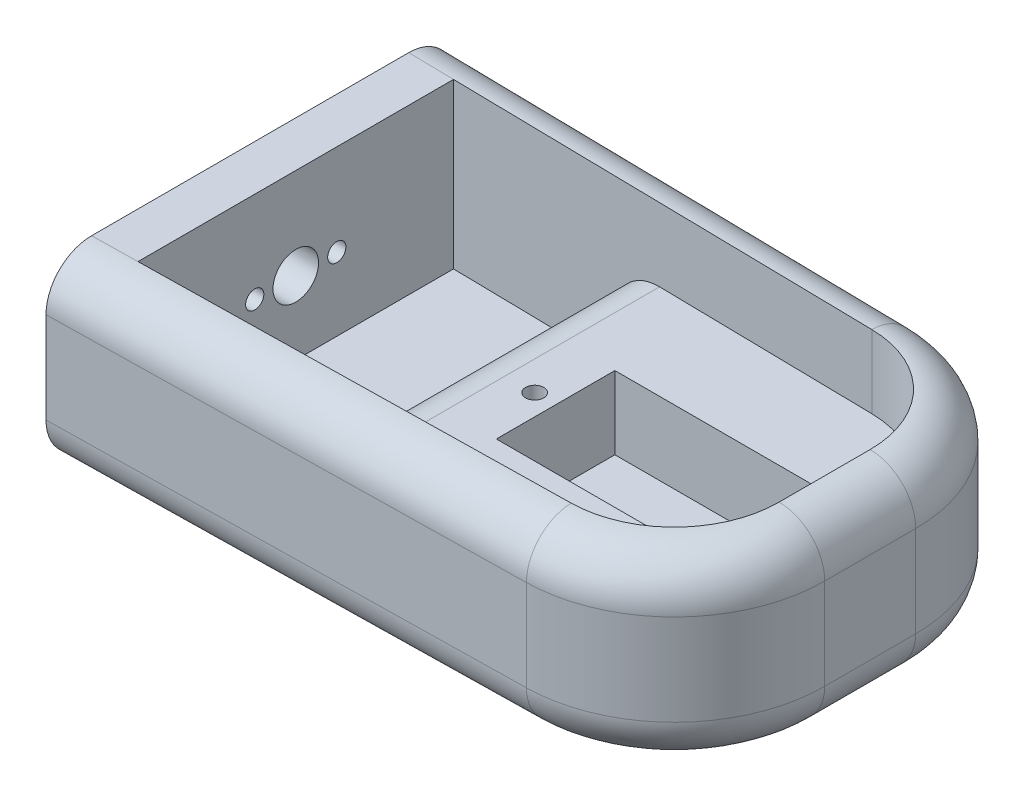
ISO-10303-21;
HEADER;
FILE_DESCRIPTION(('STEP AP214'),'2;1');
FILE_NAME('part.step','',(''),(''),'','','');
FILE_SCHEMA(('AUTOMOTIVE_DESIGN { 1 0 10303 214 1 1 1 1 }'));
ENDSEC;
DATA;
#1=APPLICATION_CONTEXT('core data for automotive mechanical design processes');
#2=APPLICATION_PROTOCOL_DEFINITION('international standard','automotive_design',2000,#1);
#3=PRODUCT_CONTEXT('',#1,'mechanical');
#4=PRODUCT('Part','Part','',(#3));
#5=PRODUCT_RELATED_PRODUCT_CATEGORY('part','',(#4));
#6=PRODUCT_DEFINITION_FORMATION('','',#4);
#7=PRODUCT_DEFINITION_CONTEXT('part definition',#1,'design');
#8=PRODUCT_DEFINITION('design','',#6,#7);
#9=PRODUCT_DEFINITION_SHAPE('','',#8);
#10=(LENGTH_UNIT() NAMED_UNIT(*) SI_UNIT(.MILLI.,.METRE.));
#11=(NAMED_UNIT(*) PLANE_ANGLE_UNIT() SI_UNIT($,.RADIAN.));
#12=(NAMED_UNIT(*) SI_UNIT($,.STERADIAN.) SOLID_ANGLE_UNIT());
#13=UNCERTAINTY_MEASURE_WITH_UNIT(LENGTH_MEASURE(1.E-05),#10,'distance_accuracy_value','');
#14=(GEOMETRIC_REPRESENTATION_CONTEXT(3) GLOBAL_UNCERTAINTY_ASSIGNED_CONTEXT((#13)) GLOBAL_UNIT_ASSIGNED_CONTEXT((#10,
#11,#12)) REPRESENTATION_CONTEXT('',''));
#15=CARTESIAN_POINT('',(0.,0.,0.));
#16=DIRECTION('',(0.,0.,1.));
#17=DIRECTION('',(1.,0.,0.));
#18=AXIS2_PLACEMENT_3D('',#15,#16,#17);
#19=CARTESIAN_POINT('',(0.,4.,0.));
#20=DIRECTION('',(0.,1.,0.));
#21=DIRECTION('',(0.,0.,1.));
#22=AXIS2_PLACEMENT_3D('',#19,#20,#21);
#23=PLANE('',#22);
#24=CARTESIAN_POINT('',(50.,4.,-22.39));
#25=DIRECTION('',(0.,1.,0.));
#26=DIRECTION('',(0.,0.,1.));
#27=AXIS2_PLACEMENT_3D('',#24,#25,#26);
#28=CIRCLE('',#27,6.5);
#29=CARTESIAN_POINT('',(50.,4.,-15.89));
#30=VERTEX_POINT('',#29);
#31=CARTESIAN_POINT('',(56.5,4.,-22.39));
#32=VERTEX_POINT('',#31);
#33=EDGE_CURVE('E218',#30,#32,#28,.T.);
#34=ORIENTED_EDGE('',*,*,#33,.F.);
#35=DIRECTION('',(1.,0.,0.));
#36=VECTOR('',#35,1.);
#37=CARTESIAN_POINT('',(56.5,4.,-15.89));
#38=LINE('',#37,#36);
#39=CARTESIAN_POINT('',(56.5,4.,-15.89));
#40=VERTEX_POINT('',#39);
#41=EDGE_CURVE('E229',#30,#40,#38,.T.);
#42=ORIENTED_EDGE('',*,*,#41,.T.);
#43=DIRECTION('',(0.,0.,-1.));
#44=VECTOR('',#43,1.);
#45=CARTESIAN_POINT('',(56.5,4.,-15.89));
#46=LINE('',#45,#44);
#47=EDGE_CURVE('E232',#40,#32,#46,.T.);
#48=ORIENTED_EDGE('',*,*,#47,.T.);
#49=EDGE_LOOP('',(#34,#42,#48));
#50=FACE_BOUND('',#49,.T.);
#51=ADVANCED_FACE('F52',(#50),#23,.T.);
#52=CARTESIAN_POINT('',(50.,4.,-28.89));
#53=VERTEX_POINT('',#52);
#54=EDGE_CURVE('E220',#32,#53,#28,.T.);
#55=ORIENTED_EDGE('',*,*,#54,.F.);
#56=CARTESIAN_POINT('',(56.5,4.,-28.89));
#57=VERTEX_POINT('',#56);
#58=EDGE_CURVE('E262',#32,#57,#46,.T.);
#59=ORIENTED_EDGE('',*,*,#58,.T.);
#60=DIRECTION('',(-1.,0.,0.));
#61=VECTOR('',#60,1.);
#62=CARTESIAN_POINT('',(56.5,4.,-28.89));
#63=LINE('',#62,#61);
#64=EDGE_CURVE('E907',#57,#53,#63,.T.);
#65=ORIENTED_EDGE('',*,*,#64,.T.);
#66=EDGE_LOOP('',(#55,#59,#65));
#67=FACE_BOUND('',#66,.T.);
#68=ADVANCED_FACE('F510',(#67),#23,.T.);
#69=CARTESIAN_POINT('',(51.7007026740287,20.,-5.90320076222937));
#70=DIRECTION('',(-0.0174524064372871,0.,-0.999847695156391));
#71=DIRECTION('',(-0.999847695156391,0.,0.0174524064372871));
#72=AXIS2_PLACEMENT_3D('',#69,#70,#71);
#73=PLANE('',#72);
#74=DIRECTION('',(0.999847695156391,0.,-0.0174524064372872));
#75=VECTOR('',#74,1.);
#76=CARTESIAN_POINT('',(51.7007026740287,12.,-5.90320076222937));
#77=LINE('',#76,#75);
#78=CARTESIAN_POINT('',(28.,12.,-5.48950345820973));
#79=VERTEX_POINT('',#78);
#80=CARTESIAN_POINT('',(51.7007026740287,12.,-5.90320076222937));
#81=VERTEX_POINT('',#80);
#82=EDGE_CURVE('E271',#79,#81,#77,.T.);
#83=ORIENTED_EDGE('',*,*,#82,.F.);
#84=CARTESIAN_POINT('',(28.,7.,-5.48950345820973));
#85=DIRECTION('',(-0.0174524064372871,0.,-0.999847695156391));
#86=DIRECTION('',(-0.999847695156391,0.,0.0174524064372871));
#87=AXIS2_PLACEMENT_3D('',#84,#85,#86);
#88=ELLIPSE('',#87,5.00076164021954,5.);
#89=CARTESIAN_POINT('',(23.,7.,-5.40222813356863));
#90=VERTEX_POINT('',#89);
#91=EDGE_CURVE('E61',#79,#90,#88,.F.);
#92=ORIENTED_EDGE('',*,*,#91,.T.);
#93=DIRECTION('',(0.,-1.,0.));
#94=VECTOR('',#93,1.);
#95=CARTESIAN_POINT('',(23.,12.,-5.40222813356863));
#96=LINE('',#95,#94);
#97=CARTESIAN_POINT('',(23.,2.,-5.40222813356863));
#98=VERTEX_POINT('',#97);
#99=EDGE_CURVE('E282',#90,#98,#96,.T.);
#100=ORIENTED_EDGE('',*,*,#99,.T.);
#101=DIRECTION('',(0.999847695156391,0.,-0.0174524064372871));
#102=VECTOR('',#101,1.);
#103=CARTESIAN_POINT('',(51.8748005842509,2.,-5.90623965255616));
#104=LINE('',#103,#102);
#105=CARTESIAN_POINT('',(5.,2.,-5.08803696486064));
#106=VERTEX_POINT('',#105);
#107=EDGE_CURVE('E288',#106,#98,#104,.T.);
#108=ORIENTED_EDGE('',*,*,#107,.F.);
#109=DIRECTION('',(0.,-1.,0.));
#110=VECTOR('',#109,1.);
#111=CARTESIAN_POINT('',(5.,20.,-5.08803696486064));
#112=LINE('',#111,#110);
#113=CARTESIAN_POINT('',(5.,20.,-5.08803696486064));
#114=VERTEX_POINT('',#113);
#115=EDGE_CURVE('E297',#114,#106,#112,.T.);
#116=ORIENTED_EDGE('',*,*,#115,.F.);
#117=DIRECTION('',(0.999847695156391,0.,-0.0174524064372871));
#118=VECTOR('',#117,1.);
#119=CARTESIAN_POINT('',(51.8748005842509,20.,-5.90623965255616));
#120=LINE('',#119,#118);
#121=CARTESIAN_POINT('',(51.7007026740287,20.,-5.90320076222937));
#122=VERTEX_POINT('',#121);
#123=EDGE_CURVE('E315',#114,#122,#120,.T.);
#124=ORIENTED_EDGE('',*,*,#123,.T.);
#125=DIRECTION('',(0.,-1.,0.));
#126=VECTOR('',#125,1.);
#127=CARTESIAN_POINT('',(51.7007026740287,20.,-5.90320076222937));
#128=LINE('',#127,#126);
#129=EDGE_CURVE('E292',#122,#81,#128,.T.);
#130=ORIENTED_EDGE('',*,*,#129,.T.);
#131=EDGE_LOOP('',(#83,#92,#100,#108,#116,#124,#130));
#132=FACE_BOUND('',#131,.T.);
#133=ADVANCED_FACE('F451',(#132),#73,.T.);
#134=CARTESIAN_POINT('',(51.5,20.,-17.4014492565279));
#135=DIRECTION('',(0.,-1.,0.));
#136=DIRECTION('',(0.,0.,-1.));
#137=AXIS2_PLACEMENT_3D('',#134,#135,#136);
#138=CYLINDRICAL_SURFACE('',#137,11.5);
#139=DIRECTION('',(0.,1.,0.));
#140=VECTOR('',#139,1.);
#141=CARTESIAN_POINT('',(63.,20.,-17.401449256528));
#142=LINE('',#141,#140);
#143=CARTESIAN_POINT('',(63.,20.,-17.4014492565279));
#144=VERTEX_POINT('',#143);
#145=CARTESIAN_POINT('',(63.,12.,-17.401449256528));
#146=VERTEX_POINT('',#145);
#147=EDGE_CURVE('E296',#144,#146,#142,.F.);
#148=ORIENTED_EDGE('',*,*,#147,.T.);
#149=CARTESIAN_POINT('',(51.5,12.,-17.4014492565279));
#150=DIRECTION('',(0.,1.,0.));
#151=DIRECTION('',(0.,0.,-1.));
#152=AXIS2_PLACEMENT_3D('',#149,#150,#151);
#153=CIRCLE('',#152,11.5);
#154=EDGE_CURVE('E273',#81,#146,#153,.T.);
#155=ORIENTED_EDGE('',*,*,#154,.F.);
#156=ORIENTED_EDGE('',*,*,#129,.F.);
#157=CARTESIAN_POINT('',(51.5,20.,-17.4014492565279));
#158=DIRECTION('',(0.,-1.,0.));
#159=DIRECTION('',(0.,0.,-1.));
#160=AXIS2_PLACEMENT_3D('',#157,#158,#159);
#161=CIRCLE('',#160,11.5);
#162=EDGE_CURVE('E317',#122,#144,#161,.F.);
#163=ORIENTED_EDGE('',*,*,#162,.T.);
#164=EDGE_LOOP('',(#148,#155,#156,#163));
#165=FACE_BOUND('',#164,.T.);
#166=ADVANCED_FACE('F465',(#165),#138,.F.);
#167=CARTESIAN_POINT('',(63.,20.,-27.378550743472));
#168=DIRECTION('',(-1.,0.,0.));
#169=DIRECTION('',(0.,0.,1.));
#170=AXIS2_PLACEMENT_3D('',#167,#168,#169);
#171=PLANE('',#170);
#172=DIRECTION('',(0.,-1.,0.));
#173=VECTOR('',#172,1.);
#174=CARTESIAN_POINT('',(63.,20.,-27.3785507434721));
#175=LINE('',#174,#173);
#176=CARTESIAN_POINT('',(63.,20.,-27.378550743472));
#177=VERTEX_POINT('',#176);
#178=CARTESIAN_POINT('',(63.,12.,-27.3785507434721));
#179=VERTEX_POINT('',#178);
#180=EDGE_CURVE('E304',#177,#179,#175,.T.);
#181=ORIENTED_EDGE('',*,*,#180,.T.);
#182=DIRECTION('',(0.,0.,-1.));
#183=VECTOR('',#182,1.);
#184=CARTESIAN_POINT('',(63.,12.,-27.3785507434721));
#185=LINE('',#184,#183);
#186=EDGE_CURVE('E276',#146,#179,#185,.T.);
#187=ORIENTED_EDGE('',*,*,#186,.F.);
#188=ORIENTED_EDGE('',*,*,#147,.F.);
#189=DIRECTION('',(0.,0.,-1.));
#190=VECTOR('',#189,1.);
#191=CARTESIAN_POINT('',(63.,20.,-27.3785507434721));
#192=LINE('',#191,#190);
#193=EDGE_CURVE('E319',#144,#177,#192,.T.);
#194=ORIENTED_EDGE('',*,*,#193,.T.);
#195=EDGE_LOOP('',(#181,#187,#188,#194));
#196=FACE_BOUND('',#195,.T.);
#197=ADVANCED_FACE('F498',(#196),#171,.T.);
#198=CARTESIAN_POINT('',(51.5,20.,-27.3785507434721));
#199=DIRECTION('',(0.,-1.,0.));
#200=DIRECTION('',(0.,0.,-1.));
#201=AXIS2_PLACEMENT_3D('',#198,#199,#200);
#202=CYLINDRICAL_SURFACE('',#201,11.5);
#203=DIRECTION('',(0.,1.,0.));
#204=VECTOR('',#203,1.);
#205=CARTESIAN_POINT('',(51.7007026740287,20.,-38.8767992377706));
#206=LINE('',#205,#204);
#207=CARTESIAN_POINT('',(51.7007026740287,20.,-38.8767992377706));
#208=VERTEX_POINT('',#207);
#209=CARTESIAN_POINT('',(51.7007026740287,12.,-38.8767992377706));
#210=VERTEX_POINT('',#209);
#211=EDGE_CURVE('E307',#208,#210,#206,.F.);
#212=ORIENTED_EDGE('',*,*,#211,.T.);
#213=CARTESIAN_POINT('',(51.5,12.,-27.3785507434721));
#214=DIRECTION('',(0.,1.,0.));
#215=DIRECTION('',(0.,0.,-1.));
#216=AXIS2_PLACEMENT_3D('',#213,#214,#215);
#217=CIRCLE('',#216,11.5);
#218=EDGE_CURVE('E279',#179,#210,#217,.T.);
#219=ORIENTED_EDGE('',*,*,#218,.F.);
#220=ORIENTED_EDGE('',*,*,#180,.F.);
#221=CARTESIAN_POINT('',(51.5,20.,-27.3785507434721));
#222=DIRECTION('',(0.,-1.,0.));
#223=DIRECTION('',(0.,0.,-1.));
#224=AXIS2_PLACEMENT_3D('',#221,#222,#223);
#225=CIRCLE('',#224,11.5);
#226=EDGE_CURVE('E321',#177,#208,#225,.F.);
#227=ORIENTED_EDGE('',*,*,#226,.T.);
#228=EDGE_LOOP('',(#212,#219,#220,#227));
#229=FACE_BOUND('',#228,.T.);
#230=ADVANCED_FACE('F500',(#229),#202,.F.);
#231=CARTESIAN_POINT('',(-0.0872620321864352,20.,-39.780761524218));
#232=DIRECTION('',(-0.017452406437287,0.,0.999847695156391));
#233=DIRECTION('',(0.999847695156391,0.,0.017452406437287));
#234=AXIS2_PLACEMENT_3D('',#231,#232,#233);
#235=PLANE('',#234);
#236=DIRECTION('',(-0.999847695156391,0.,-0.017452406437287));
#237=VECTOR('',#236,1.);
#238=CARTESIAN_POINT('',(51.7007026740288,2.,-38.8767992377706));
#239=LINE('',#238,#237);
#240=CARTESIAN_POINT('',(23.,2.,-39.3777718664314));
#241=VERTEX_POINT('',#240);
#242=CARTESIAN_POINT('',(5.,2.,-39.6919630351394));
#243=VERTEX_POINT('',#242);
#244=EDGE_CURVE('E291',#241,#243,#239,.T.);
#245=ORIENTED_EDGE('',*,*,#244,.F.);
#246=DIRECTION('',(0.,-1.,0.));
#247=VECTOR('',#246,1.);
#248=CARTESIAN_POINT('',(23.,12.,-39.3777718664314));
#249=LINE('',#248,#247);
#250=CARTESIAN_POINT('',(23.,7.,-39.3777718664314));
#251=VERTEX_POINT('',#250);
#252=EDGE_CURVE('E286',#251,#241,#249,.T.);
#253=ORIENTED_EDGE('',*,*,#252,.F.);
#254=CARTESIAN_POINT('',(28.,7.,-39.2904965417903));
#255=DIRECTION('',(-0.017452406437287,0.,0.999847695156391));
#256=DIRECTION('',(0.999847695156391,0.,0.017452406437287));
#257=AXIS2_PLACEMENT_3D('',#254,#255,#256);
#258=ELLIPSE('',#257,5.00076164021954,5.);
#259=CARTESIAN_POINT('',(28.,12.,-39.2904965417903));
#260=VERTEX_POINT('',#259);
#261=EDGE_CURVE('E13',#251,#260,#258,.F.);
#262=ORIENTED_EDGE('',*,*,#261,.T.);
#263=DIRECTION('',(-0.999847695156391,0.,-0.0174524064372869));
#264=VECTOR('',#263,1.);
#265=CARTESIAN_POINT('',(23.,12.,-39.3777718664314));
#266=LINE('',#265,#264);
#267=EDGE_CURVE('E268',#210,#260,#266,.T.);
#268=ORIENTED_EDGE('',*,*,#267,.F.);
#269=ORIENTED_EDGE('',*,*,#211,.F.);
#270=DIRECTION('',(-0.999847695156391,0.,-0.017452406437287));
#271=VECTOR('',#270,1.);
#272=CARTESIAN_POINT('',(51.7007026740288,20.,-38.8767992377706));
#273=LINE('',#272,#271);
#274=CARTESIAN_POINT('',(5.,20.,-39.6919630351394));
#275=VERTEX_POINT('',#274);
#276=EDGE_CURVE('E323',#208,#275,#273,.T.);
#277=ORIENTED_EDGE('',*,*,#276,.T.);
#278=DIRECTION('',(0.,-1.,0.));
#279=VECTOR('',#278,1.);
#280=CARTESIAN_POINT('',(5.,20.,-39.6919630351394));
#281=LINE('',#280,#279);
#282=EDGE_CURVE('E300',#275,#243,#281,.T.);
#283=ORIENTED_EDGE('',*,*,#282,.T.);
#284=EDGE_LOOP('',(#245,#253,#262,#268,#269,#277,#283));
#285=FACE_BOUND('',#284,.T.);
#286=ADVANCED_FACE('F441',(#285),#235,.T.);
#287=CARTESIAN_POINT('',(51.5,20.,-27.3785507434721));
#288=DIRECTION('',(0.,-1.,0.));
#289=DIRECTION('',(0.,0.,-1.));
#290=AXIS2_PLACEMENT_3D('',#287,#288,#289);
#291=PLANE('',#290);
#292=DIRECTION('',(0.,0.,1.));
#293=VECTOR('',#292,1.);
#294=CARTESIAN_POINT('',(0.,20.,0.));
#295=LINE('',#294,#293);
#296=CARTESIAN_POINT('',(0.,20.,-39.7792383597804));
#297=VERTEX_POINT('',#296);
#298=CARTESIAN_POINT('',(0.,20.,-5.00076164021953));
#299=VERTEX_POINT('',#298);
#300=EDGE_CURVE('E328',#297,#299,#295,.T.);
#301=ORIENTED_EDGE('',*,*,#300,.T.);
#302=DIRECTION('',(0.999847695156391,0.,-0.0174524064372871));
#303=VECTOR('',#302,1.);
#304=CARTESIAN_POINT('',(51.8748005842509,20.,-5.90623965255616));
#305=LINE('',#304,#303);
#306=EDGE_CURVE('E390',#299,#114,#305,.T.);
#307=ORIENTED_EDGE('',*,*,#306,.T.);
#308=DIRECTION('',(0.,0.,1.));
#309=VECTOR('',#308,1.);
#310=CARTESIAN_POINT('',(5.,20.,-27.3785507434721));
#311=LINE('',#310,#309);
#312=EDGE_CURVE('E301',#275,#114,#311,.T.);
#313=ORIENTED_EDGE('',*,*,#312,.F.);
#314=DIRECTION('',(-0.999847695156391,0.,-0.017452406437287));
#315=VECTOR('',#314,1.);
#316=CARTESIAN_POINT('',(51.7007026740288,20.,-38.8767992377706));
#317=LINE('',#316,#315);
#318=EDGE_CURVE('E388',#275,#297,#317,.T.);
#319=ORIENTED_EDGE('',*,*,#318,.T.);
#320=EDGE_LOOP('',(#301,#307,#313,#319));
#321=FACE_BOUND('',#320,.T.);
#322=ADVANCED_FACE('F444',(#321),#291,.F.);
#323=CARTESIAN_POINT('',(51.7879647062151,20.,-0.90396228644741));
#324=DIRECTION('',(-0.0174524064372871,0.,-0.999847695156391));
#325=DIRECTION('',(-0.999847695156391,0.,0.0174524064372871));
#326=AXIS2_PLACEMENT_3D('',#323,#324,#325);
#327=PLANE('',#326);
#328=DIRECTION('',(0.,-1.,0.));
#329=VECTOR('',#328,1.);
#330=CARTESIAN_POINT('',(0.,20.,0.));
#331=LINE('',#330,#329);
#332=CARTESIAN_POINT('',(0.,15.,0.));
#333=VERTEX_POINT('',#332);
#334=CARTESIAN_POINT('',(0.,5.,0.));
#335=VERTEX_POINT('',#334);
#336=EDGE_CURVE('E331',#333,#335,#331,.T.);
#337=ORIENTED_EDGE('',*,*,#336,.T.);
#338=DIRECTION('',(0.999847695156391,0.,-0.0174524064372871));
#339=VECTOR('',#338,1.);
#340=CARTESIAN_POINT('',(51.7879647062152,5.,-0.90396228644741));
#341=LINE('',#340,#339);
#342=CARTESIAN_POINT('',(51.7879647062151,5.,-0.903962286447416));
#343=VERTEX_POINT('',#342);
#344=EDGE_CURVE('E355',#335,#343,#341,.T.);
#345=ORIENTED_EDGE('',*,*,#344,.T.);
#346=DIRECTION('',(0.,-1.,0.));
#347=VECTOR('',#346,1.);
#348=CARTESIAN_POINT('',(51.7879647062151,20.,-0.903962286447416));
#349=LINE('',#348,#347);
#350=CARTESIAN_POINT('',(51.7879647062151,15.,-0.903962286447416));
#351=VERTEX_POINT('',#350);
#352=EDGE_CURVE('E348',#351,#343,#349,.T.);
#353=ORIENTED_EDGE('',*,*,#352,.F.);
#354=DIRECTION('',(0.999847695156391,0.,-0.0174524064372871));
#355=VECTOR('',#354,1.);
#356=CARTESIAN_POINT('',(51.7879647062151,15.,-0.90396228644741));
#357=LINE('',#356,#355);
#358=EDGE_CURVE('E351',#351,#333,#357,.F.);
#359=ORIENTED_EDGE('',*,*,#358,.T.);
#360=EDGE_LOOP('',(#337,#345,#353,#359));
#361=FACE_BOUND('',#360,.T.);
#362=ADVANCED_FACE('F479',(#361),#327,.F.);
#363=CARTESIAN_POINT('',(51.5,20.,-17.4014492565279));
#364=DIRECTION('',(0.,-1.,0.));
#365=DIRECTION('',(0.,0.,-1.));
#366=AXIS2_PLACEMENT_3D('',#363,#364,#365);
#367=CYLINDRICAL_SURFACE('',#366,16.5);
#368=ORIENTED_EDGE('',*,*,#352,.T.);
#369=CARTESIAN_POINT('',(51.5,5.,-17.4014492565279));
#370=DIRECTION('',(0.,-1.,0.));
#371=DIRECTION('',(0.,0.,-1.));
#372=AXIS2_PLACEMENT_3D('',#369,#370,#371);
#373=CIRCLE('',#372,16.5);
#374=CARTESIAN_POINT('',(68.,5.,-17.401449256528));
#375=VERTEX_POINT('',#374);
#376=EDGE_CURVE('E378',#343,#375,#373,.F.);
#377=ORIENTED_EDGE('',*,*,#376,.T.);
#378=DIRECTION('',(0.,-1.,0.));
#379=VECTOR('',#378,1.);
#380=CARTESIAN_POINT('',(68.,20.,-17.401449256528));
#381=LINE('',#380,#379);
#382=CARTESIAN_POINT('',(68.,15.,-17.401449256528));
#383=VERTEX_POINT('',#382);
#384=EDGE_CURVE('E345',#383,#375,#381,.T.);
#385=ORIENTED_EDGE('',*,*,#384,.F.);
#386=CARTESIAN_POINT('',(51.5,15.,-17.4014492565279));
#387=DIRECTION('',(0.,-1.,0.));
#388=DIRECTION('',(0.,0.,-1.));
#389=AXIS2_PLACEMENT_3D('',#386,#387,#388);
#390=CIRCLE('',#389,16.5);
#391=EDGE_CURVE('E376',#383,#351,#390,.T.);
#392=ORIENTED_EDGE('',*,*,#391,.T.);
#393=EDGE_LOOP('',(#368,#377,#385,#392));
#394=FACE_BOUND('',#393,.T.);
#395=ADVANCED_FACE('F491',(#394),#367,.T.);
#396=CARTESIAN_POINT('',(68.,20.,-27.378550743472));
#397=DIRECTION('',(-1.,0.,0.));
#398=DIRECTION('',(0.,0.,1.));
#399=AXIS2_PLACEMENT_3D('',#396,#397,#398);
#400=PLANE('',#399);
#401=ORIENTED_EDGE('',*,*,#384,.T.);
#402=DIRECTION('',(0.,0.,-1.));
#403=VECTOR('',#402,1.);
#404=CARTESIAN_POINT('',(68.,5.,-27.378550743472));
#405=LINE('',#404,#403);
#406=CARTESIAN_POINT('',(68.,5.,-27.378550743472));
#407=VERTEX_POINT('',#406);
#408=EDGE_CURVE('E382',#375,#407,#405,.T.);
#409=ORIENTED_EDGE('',*,*,#408,.T.);
#410=DIRECTION('',(0.,-1.,0.));
#411=VECTOR('',#410,1.);
#412=CARTESIAN_POINT('',(68.,20.,-27.378550743472));
#413=LINE('',#412,#411);
#414=CARTESIAN_POINT('',(68.,15.,-27.378550743472));
#415=VERTEX_POINT('',#414);
#416=EDGE_CURVE('E342',#415,#407,#413,.T.);
#417=ORIENTED_EDGE('',*,*,#416,.F.);
#418=DIRECTION('',(0.,0.,-1.));
#419=VECTOR('',#418,1.);
#420=CARTESIAN_POINT('',(68.,15.,-27.378550743472));
#421=LINE('',#420,#419);
#422=EDGE_CURVE('E380',#415,#383,#421,.F.);
#423=ORIENTED_EDGE('',*,*,#422,.T.);
#424=EDGE_LOOP('',(#401,#409,#417,#423));
#425=FACE_BOUND('',#424,.T.);
#426=ADVANCED_FACE('F595',(#425),#400,.F.);
#427=CARTESIAN_POINT('',(51.5,20.,-27.3785507434721));
#428=DIRECTION('',(0.,-1.,0.));
#429=DIRECTION('',(0.,0.,-1.));
#430=AXIS2_PLACEMENT_3D('',#427,#428,#429);
#431=CYLINDRICAL_SURFACE('',#430,16.5);
#432=ORIENTED_EDGE('',*,*,#416,.T.);
#433=CARTESIAN_POINT('',(51.5,5.,-27.3785507434721));
#434=DIRECTION('',(0.,-1.,0.));
#435=DIRECTION('',(0.,0.,-1.));
#436=AXIS2_PLACEMENT_3D('',#433,#434,#435);
#437=CIRCLE('',#436,16.5);
#438=CARTESIAN_POINT('',(51.7879647062151,5.,-43.8760377135526));
#439=VERTEX_POINT('',#438);
#440=EDGE_CURVE('E386',#407,#439,#437,.F.);
#441=ORIENTED_EDGE('',*,*,#440,.T.);
#442=DIRECTION('',(0.,-1.,0.));
#443=VECTOR('',#442,1.);
#444=CARTESIAN_POINT('',(51.7879647062151,20.,-43.8760377135526));
#445=LINE('',#444,#443);
#446=CARTESIAN_POINT('',(51.7879647062151,15.,-43.8760377135526));
#447=VERTEX_POINT('',#446);
#448=EDGE_CURVE('E339',#447,#439,#445,.T.);
#449=ORIENTED_EDGE('',*,*,#448,.F.);
#450=CARTESIAN_POINT('',(51.5,15.,-27.3785507434721));
#451=DIRECTION('',(0.,-1.,0.));
#452=DIRECTION('',(0.,0.,-1.));
#453=AXIS2_PLACEMENT_3D('',#450,#451,#452);
#454=CIRCLE('',#453,16.5);
#455=EDGE_CURVE('E384',#447,#415,#454,.T.);
#456=ORIENTED_EDGE('',*,*,#455,.T.);
#457=EDGE_LOOP('',(#432,#441,#449,#456));
#458=FACE_BOUND('',#457,.T.);
#459=ADVANCED_FACE('F604',(#458),#431,.T.);
#460=CARTESIAN_POINT('',(0.,20.,-44.78));
#461=DIRECTION('',(-0.017452406437287,0.,0.999847695156391));
#462=DIRECTION('',(0.999847695156391,0.,0.017452406437287));
#463=AXIS2_PLACEMENT_3D('',#460,#461,#462);
#464=PLANE('',#463);
#465=ORIENTED_EDGE('',*,*,#448,.T.);
#466=DIRECTION('',(-0.999847695156391,0.,-0.017452406437287));
#467=VECTOR('',#466,1.);
#468=CARTESIAN_POINT('',(0.,5.,-44.78));
#469=LINE('',#468,#467);
#470=CARTESIAN_POINT('',(0.,5.,-44.78));
#471=VERTEX_POINT('',#470);
#472=EDGE_CURVE('E399',#439,#471,#469,.T.);
#473=ORIENTED_EDGE('',*,*,#472,.T.);
#474=DIRECTION('',(0.,-1.,0.));
#475=VECTOR('',#474,1.);
#476=CARTESIAN_POINT('',(0.,20.,-44.78));
#477=LINE('',#476,#475);
#478=CARTESIAN_POINT('',(0.,15.,-44.78));
#479=VERTEX_POINT('',#478);
#480=EDGE_CURVE('E336',#479,#471,#477,.T.);
#481=ORIENTED_EDGE('',*,*,#480,.F.);
#482=DIRECTION('',(-0.999847695156391,0.,-0.017452406437287));
#483=VECTOR('',#482,1.);
#484=CARTESIAN_POINT('',(0.,15.,-44.78));
#485=LINE('',#484,#483);
#486=EDGE_CURVE('E397',#479,#447,#485,.F.);
#487=ORIENTED_EDGE('',*,*,#486,.T.);
#488=EDGE_LOOP('',(#465,#473,#481,#487));
#489=FACE_BOUND('',#488,.T.);
#490=ADVANCED_FACE('F613',(#489),#464,.F.);
#491=CARTESIAN_POINT('',(0.,20.,0.));
#492=DIRECTION('',(1.,0.,0.));
#493=DIRECTION('',(0.,0.,-1.));
#494=AXIS2_PLACEMENT_3D('',#491,#492,#493);
#495=PLANE('',#494);
#496=CARTESIAN_POINT('',(0.,10.,-26.89));
#497=DIRECTION('',(1.,0.,0.));
#498=DIRECTION('',(0.,0.,-1.));
#499=AXIS2_PLACEMENT_3D('',#496,#497,#498);
#500=CIRCLE('',#499,1.);
#501=CARTESIAN_POINT('',(0.,10.,-27.89));
#502=VERTEX_POINT('',#501);
#503=EDGE_CURVE('E897',#502,#502,#500,.T.);
#504=ORIENTED_EDGE('',*,*,#503,.T.);
#505=EDGE_LOOP('',(#504));
#506=FACE_BOUND('',#505,.T.);
#507=CARTESIAN_POINT('',(0.,10.,-17.89));
#508=DIRECTION('',(1.,0.,0.));
#509=DIRECTION('',(0.,0.,-1.));
#510=AXIS2_PLACEMENT_3D('',#507,#508,#509);
#511=CIRCLE('',#510,1.);
#512=CARTESIAN_POINT('',(0.,10.,-18.89));
#513=VERTEX_POINT('',#512);
#514=EDGE_CURVE('E902',#513,#513,#511,.T.);
#515=ORIENTED_EDGE('',*,*,#514,.T.);
#516=EDGE_LOOP('',(#515));
#517=FACE_BOUND('',#516,.T.);
#518=CARTESIAN_POINT('',(0.,10.,-22.39));
#519=DIRECTION('',(1.,0.,0.));
#520=DIRECTION('',(0.,0.,-1.));
#521=AXIS2_PLACEMENT_3D('',#518,#519,#520);
#522=CIRCLE('',#521,2.5);
#523=CARTESIAN_POINT('',(0.,10.,-24.89));
#524=VERTEX_POINT('',#523);
#525=EDGE_CURVE('E924',#524,#524,#522,.T.);
#526=ORIENTED_EDGE('',*,*,#525,.T.);
#527=EDGE_LOOP('',(#526));
#528=FACE_BOUND('',#527,.T.);
#529=DIRECTION('',(0.,0.,1.));
#530=VECTOR('',#529,1.);
#531=CARTESIAN_POINT('',(0.,0.,0.));
#532=LINE('',#531,#530);
#533=CARTESIAN_POINT('',(0.,0.,-39.7792383597804));
#534=VERTEX_POINT('',#533);
#535=CARTESIAN_POINT('',(0.,0.,-5.00076164021954));
#536=VERTEX_POINT('',#535);
#537=EDGE_CURVE('E295',#534,#536,#532,.T.);
#538=ORIENTED_EDGE('',*,*,#537,.T.);
#539=CARTESIAN_POINT('',(0.,5.,-5.00076164021954));
#540=DIRECTION('',(1.,0.,0.));
#541=DIRECTION('',(0.,0.,1.));
#542=AXIS2_PLACEMENT_3D('',#539,#540,#541);
#543=ELLIPSE('',#542,5.00076164021954,5.);
#544=EDGE_CURVE('E374',#536,#335,#543,.F.);
#545=ORIENTED_EDGE('',*,*,#544,.T.);
#546=ORIENTED_EDGE('',*,*,#336,.F.);
#547=CARTESIAN_POINT('',(0.,15.,-5.00076164021954));
#548=DIRECTION('',(1.,0.,0.));
#549=DIRECTION('',(0.,0.,-1.));
#550=AXIS2_PLACEMENT_3D('',#547,#548,#549);
#551=ELLIPSE('',#550,5.00076164021954,5.);
#552=EDGE_CURVE('E372',#333,#299,#551,.F.);
#553=ORIENTED_EDGE('',*,*,#552,.T.);
#554=ORIENTED_EDGE('',*,*,#300,.F.);
#555=CARTESIAN_POINT('',(0.,15.,-39.7792383597805));
#556=DIRECTION('',(1.,0.,0.));
#557=DIRECTION('',(0.,0.,-1.));
#558=AXIS2_PLACEMENT_3D('',#555,#556,#557);
#559=ELLIPSE('',#558,5.00076164021954,5.);
#560=EDGE_CURVE('E368',#297,#479,#559,.F.);
#561=ORIENTED_EDGE('',*,*,#560,.T.);
#562=ORIENTED_EDGE('',*,*,#480,.T.);
#563=CARTESIAN_POINT('',(0.,5.,-39.7792383597805));
#564=DIRECTION('',(1.,0.,0.));
#565=DIRECTION('',(0.,0.,1.));
#566=AXIS2_PLACEMENT_3D('',#563,#564,#565);
#567=ELLIPSE('',#566,5.00076164021954,5.);
#568=EDGE_CURVE('E370',#471,#534,#567,.F.);
#569=ORIENTED_EDGE('',*,*,#568,.T.);
#570=EDGE_LOOP('',(#538,#545,#546,#553,#554,#561,#562,#569));
#571=FACE_BOUND('',#570,.T.);
#572=ADVANCED_FACE('F482',(#506,#517,#528,#571),#495,.F.);
#573=CARTESIAN_POINT('',(51.5,0.,-27.3785507434721));
#574=DIRECTION('',(0.,-1.,0.));
#575=DIRECTION('',(0.,0.,-1.));
#576=AXIS2_PLACEMENT_3D('',#573,#574,#575);
#577=PLANE('',#576);
#578=CARTESIAN_POINT('',(50.,0.,-22.39));
#579=DIRECTION('',(0.,-1.,0.));
#580=DIRECTION('',(0.,0.,-1.));
#581=AXIS2_PLACEMENT_3D('',#578,#579,#580);
#582=CIRCLE('',#581,6.5);
#583=CARTESIAN_POINT('',(50.,0.,-28.89));
#584=VERTEX_POINT('',#583);
#585=EDGE_CURVE('E233',#584,#584,#582,.T.);
#586=ORIENTED_EDGE('',*,*,#585,.F.);
#587=EDGE_LOOP('',(#586));
#588=FACE_BOUND('',#587,.T.);
#589=CARTESIAN_POINT('',(51.5,0.,-17.4014492565279));
#590=DIRECTION('',(0.,-1.,0.));
#591=DIRECTION('',(0.,0.,-1.));
#592=AXIS2_PLACEMENT_3D('',#589,#590,#591);
#593=CIRCLE('',#592,11.5);
#594=CARTESIAN_POINT('',(63.,0.,-17.4014492565279));
#595=VERTEX_POINT('',#594);
#596=CARTESIAN_POINT('',(51.7007026740287,0.,-5.90320076222937));
#597=VERTEX_POINT('',#596);
#598=EDGE_CURVE('E364',#595,#597,#593,.T.);
#599=ORIENTED_EDGE('',*,*,#598,.T.);
#600=DIRECTION('',(0.999847695156391,0.,-0.0174524064372871));
#601=VECTOR('',#600,1.);
#602=CARTESIAN_POINT('',(-0.0872620321864317,0.,-4.99923847578196));
#603=LINE('',#602,#601);
#604=EDGE_CURVE('E366',#597,#536,#603,.F.);
#605=ORIENTED_EDGE('',*,*,#604,.T.);
#606=ORIENTED_EDGE('',*,*,#537,.F.);
#607=DIRECTION('',(-0.999847695156391,0.,-0.017452406437287));
#608=VECTOR('',#607,1.);
#609=CARTESIAN_POINT('',(51.7007026740287,0.,-38.8767992377706));
#610=LINE('',#609,#608);
#611=CARTESIAN_POINT('',(51.7007026740287,0.,-38.8767992377706));
#612=VERTEX_POINT('',#611);
#613=EDGE_CURVE('E358',#534,#612,#610,.F.);
#614=ORIENTED_EDGE('',*,*,#613,.T.);
#615=CARTESIAN_POINT('',(51.5,0.,-27.3785507434721));
#616=DIRECTION('',(0.,-1.,0.));
#617=DIRECTION('',(0.,0.,-1.));
#618=AXIS2_PLACEMENT_3D('',#615,#616,#617);
#619=CIRCLE('',#618,11.5);
#620=CARTESIAN_POINT('',(63.,0.,-27.378550743472));
#621=VERTEX_POINT('',#620);
#622=EDGE_CURVE('E360',#612,#621,#619,.T.);
#623=ORIENTED_EDGE('',*,*,#622,.T.);
#624=DIRECTION('',(0.,0.,-1.));
#625=VECTOR('',#624,1.);
#626=CARTESIAN_POINT('',(63.,0.,-17.401449256528));
#627=LINE('',#626,#625);
#628=EDGE_CURVE('E362',#621,#595,#627,.F.);
#629=ORIENTED_EDGE('',*,*,#628,.T.);
#630=EDGE_LOOP('',(#599,#605,#606,#614,#623,#629));
#631=FACE_BOUND('',#630,.T.);
#632=ADVANCED_FACE('F632',(#588,#631),#577,.T.);
#633=CARTESIAN_POINT('',(5.,20.,0.));
#634=DIRECTION('',(1.,0.,0.));
#635=DIRECTION('',(0.,0.,-1.));
#636=AXIS2_PLACEMENT_3D('',#633,#634,#635);
#637=PLANE('',#636);
#638=CARTESIAN_POINT('',(5.,10.,-26.89));
#639=DIRECTION('',(1.,0.,0.));
#640=DIRECTION('',(0.,0.,-1.));
#641=AXIS2_PLACEMENT_3D('',#638,#639,#640);
#642=CIRCLE('',#641,1.);
#643=CARTESIAN_POINT('',(5.,10.,-27.89));
#644=VERTEX_POINT('',#643);
#645=EDGE_CURVE('E413',#644,#644,#642,.T.);
#646=ORIENTED_EDGE('',*,*,#645,.F.);
#647=EDGE_LOOP('',(#646));
#648=FACE_BOUND('',#647,.T.);
#649=CARTESIAN_POINT('',(5.,10.,-17.89));
#650=DIRECTION('',(1.,0.,0.));
#651=DIRECTION('',(0.,0.,-1.));
#652=AXIS2_PLACEMENT_3D('',#649,#650,#651);
#653=CIRCLE('',#652,1.);
#654=CARTESIAN_POINT('',(5.,10.,-18.89));
#655=VERTEX_POINT('',#654);
#656=EDGE_CURVE('E930',#655,#655,#653,.T.);
#657=ORIENTED_EDGE('',*,*,#656,.F.);
#658=EDGE_LOOP('',(#657));
#659=FACE_BOUND('',#658,.T.);
#660=CARTESIAN_POINT('',(5.,10.,-22.39));
#661=DIRECTION('',(1.,0.,0.));
#662=DIRECTION('',(0.,0.,-1.));
#663=AXIS2_PLACEMENT_3D('',#660,#661,#662);
#664=CIRCLE('',#663,2.5);
#665=CARTESIAN_POINT('',(5.,10.,-24.89));
#666=VERTEX_POINT('',#665);
#667=EDGE_CURVE('E927',#666,#666,#664,.T.);
#668=ORIENTED_EDGE('',*,*,#667,.F.);
#669=EDGE_LOOP('',(#668));
#670=FACE_BOUND('',#669,.T.);
#671=DIRECTION('',(0.,0.,1.));
#672=VECTOR('',#671,1.);
#673=CARTESIAN_POINT('',(5.,2.,-27.3785507434721));
#674=LINE('',#673,#672);
#675=EDGE_CURVE('E311',#243,#106,#674,.T.);
#676=ORIENTED_EDGE('',*,*,#675,.F.);
#677=ORIENTED_EDGE('',*,*,#282,.F.);
#678=ORIENTED_EDGE('',*,*,#312,.T.);
#679=ORIENTED_EDGE('',*,*,#115,.T.);
#680=EDGE_LOOP('',(#676,#677,#678,#679));
#681=FACE_BOUND('',#680,.T.);
#682=ADVANCED_FACE('F449',(#648,#659,#670,#681),#637,.T.);
#683=CARTESIAN_POINT('',(51.5,2.,-27.3785507434721));
#684=DIRECTION('',(0.,-1.,0.));
#685=DIRECTION('',(0.,0.,-1.));
#686=AXIS2_PLACEMENT_3D('',#683,#684,#685);
#687=PLANE('',#686);
#688=DIRECTION('',(0.,0.,1.));
#689=VECTOR('',#688,1.);
#690=CARTESIAN_POINT('',(23.,2.,-39.3777718664314));
#691=LINE('',#690,#689);
#692=EDGE_CURVE('E264',#241,#98,#691,.T.);
#693=ORIENTED_EDGE('',*,*,#692,.F.);
#694=ORIENTED_EDGE('',*,*,#244,.T.);
#695=ORIENTED_EDGE('',*,*,#675,.T.);
#696=ORIENTED_EDGE('',*,*,#107,.T.);
#697=EDGE_LOOP('',(#693,#694,#695,#696));
#698=FACE_BOUND('',#697,.T.);
#699=ADVANCED_FACE('F455',(#698),#687,.F.);
#700=CARTESIAN_POINT('',(23.,12.,-39.3777718664314));
#701=DIRECTION('',(1.,0.,0.));
#702=DIRECTION('',(0.,0.,-1.));
#703=AXIS2_PLACEMENT_3D('',#700,#701,#702);
#704=PLANE('',#703);
#705=ORIENTED_EDGE('',*,*,#99,.F.);
#706=DIRECTION('',(0.,0.,1.));
#707=VECTOR('',#706,1.);
#708=CARTESIAN_POINT('',(23.,7.,-39.3777718664314));
#709=LINE('',#708,#707);
#710=EDGE_CURVE('E69',#90,#251,#709,.F.);
#711=ORIENTED_EDGE('',*,*,#710,.T.);
#712=ORIENTED_EDGE('',*,*,#252,.T.);
#713=ORIENTED_EDGE('',*,*,#692,.T.);
#714=EDGE_LOOP('',(#705,#711,#712,#713));
#715=FACE_BOUND('',#714,.T.);
#716=ADVANCED_FACE('F456',(#715),#704,.F.);
#717=CARTESIAN_POINT('',(51.5,12.,-27.3785507434721));
#718=DIRECTION('',(0.,-1.,0.));
#719=DIRECTION('',(0.,0.,-1.));
#720=AXIS2_PLACEMENT_3D('',#717,#718,#719);
#721=PLANE('',#720);
#722=CARTESIAN_POINT('',(31.2,12.,-22.39));
#723=DIRECTION('',(0.,1.,0.));
#724=DIRECTION('',(0.,0.,1.));
#725=AXIS2_PLACEMENT_3D('',#722,#723,#724);
#726=CIRCLE('',#725,0.999999999999995);
#727=CARTESIAN_POINT('',(31.2,12.,-21.39));
#728=VERTEX_POINT('',#727);
#729=EDGE_CURVE('E899',#728,#728,#726,.T.);
#730=ORIENTED_EDGE('',*,*,#729,.F.);
#731=EDGE_LOOP('',(#730));
#732=FACE_BOUND('',#731,.T.);
#733=CARTESIAN_POINT('',(58.8,12.,-22.39));
#734=DIRECTION('',(0.,1.,0.));
#735=DIRECTION('',(0.,0.,1.));
#736=AXIS2_PLACEMENT_3D('',#733,#734,#735);
#737=CIRCLE('',#736,0.999999999999998);
#738=CARTESIAN_POINT('',(58.8,12.,-21.39));
#739=VERTEX_POINT('',#738);
#740=EDGE_CURVE('E895',#739,#739,#737,.T.);
#741=ORIENTED_EDGE('',*,*,#740,.F.);
#742=EDGE_LOOP('',(#741));
#743=FACE_BOUND('',#742,.T.);
#744=DIRECTION('',(-1.,0.,0.));
#745=VECTOR('',#744,1.);
#746=CARTESIAN_POINT('',(56.5,12.,-28.89));
#747=LINE('',#746,#745);
#748=CARTESIAN_POINT('',(56.5,12.,-28.89));
#749=VERTEX_POINT('',#748);
#750=CARTESIAN_POINT('',(33.5,12.,-28.89));
#751=VERTEX_POINT('',#750);
#752=EDGE_CURVE('E254',#749,#751,#747,.T.);
#753=ORIENTED_EDGE('',*,*,#752,.F.);
#754=DIRECTION('',(0.,0.,-1.));
#755=VECTOR('',#754,1.);
#756=CARTESIAN_POINT('',(56.5,12.,-15.89));
#757=LINE('',#756,#755);
#758=CARTESIAN_POINT('',(56.5,12.,-15.89));
#759=VERTEX_POINT('',#758);
#760=EDGE_CURVE('E252',#759,#749,#757,.T.);
#761=ORIENTED_EDGE('',*,*,#760,.F.);
#762=DIRECTION('',(1.,0.,0.));
#763=VECTOR('',#762,1.);
#764=CARTESIAN_POINT('',(56.5,12.,-15.89));
#765=LINE('',#764,#763);
#766=CARTESIAN_POINT('',(33.5,12.,-15.89));
#767=VERTEX_POINT('',#766);
#768=EDGE_CURVE('E260',#767,#759,#765,.T.);
#769=ORIENTED_EDGE('',*,*,#768,.F.);
#770=DIRECTION('',(0.,0.,1.));
#771=VECTOR('',#770,1.);
#772=CARTESIAN_POINT('',(33.5,12.,-15.89));
#773=LINE('',#772,#771);
#774=EDGE_CURVE('E257',#751,#767,#773,.T.);
#775=ORIENTED_EDGE('',*,*,#774,.F.);
#776=EDGE_LOOP('',(#753,#761,#769,#775));
#777=FACE_BOUND('',#776,.T.);
#778=ORIENTED_EDGE('',*,*,#267,.T.);
#779=DIRECTION('',(0.,0.,1.));
#780=VECTOR('',#779,1.);
#781=CARTESIAN_POINT('',(28.,12.,-27.3785507434721));
#782=LINE('',#781,#780);
#783=EDGE_CURVE('E393',#260,#79,#782,.T.);
#784=ORIENTED_EDGE('',*,*,#783,.T.);
#785=ORIENTED_EDGE('',*,*,#82,.T.);
#786=ORIENTED_EDGE('',*,*,#154,.T.);
#787=ORIENTED_EDGE('',*,*,#186,.T.);
#788=ORIENTED_EDGE('',*,*,#218,.T.);
#789=EDGE_LOOP('',(#778,#784,#785,#786,#787,#788));
#790=FACE_BOUND('',#789,.T.);
#791=ADVANCED_FACE('F461',(#732,#743,#777,#790),#721,.F.);
#792=CARTESIAN_POINT('',(56.5,4.,-15.89));
#793=DIRECTION('',(1.,0.,0.));
#794=DIRECTION('',(0.,0.,-1.));
#795=AXIS2_PLACEMENT_3D('',#792,#793,#794);
#796=PLANE('',#795);
#797=ORIENTED_EDGE('',*,*,#760,.T.);
#798=DIRECTION('',(0.,1.,0.));
#799=VECTOR('',#798,1.);
#800=CARTESIAN_POINT('',(56.5,4.,-28.89));
#801=LINE('',#800,#799);
#802=EDGE_CURVE('E245',#57,#749,#801,.T.);
#803=ORIENTED_EDGE('',*,*,#802,.F.);
#804=ORIENTED_EDGE('',*,*,#58,.F.);
#805=ORIENTED_EDGE('',*,*,#47,.F.);
#806=DIRECTION('',(0.,1.,0.));
#807=VECTOR('',#806,1.);
#808=CARTESIAN_POINT('',(56.5,4.,-15.89));
#809=LINE('',#808,#807);
#810=EDGE_CURVE('E239',#40,#759,#809,.T.);
#811=ORIENTED_EDGE('',*,*,#810,.T.);
#812=EDGE_LOOP('',(#797,#803,#804,#805,#811));
#813=FACE_BOUND('',#812,.T.);
#814=ADVANCED_FACE('F536',(#813),#796,.F.);
#815=CARTESIAN_POINT('',(56.5,4.,-15.89));
#816=DIRECTION('',(0.,0.,1.));
#817=DIRECTION('',(1.,0.,0.));
#818=AXIS2_PLACEMENT_3D('',#815,#816,#817);
#819=PLANE('',#818);
#820=ORIENTED_EDGE('',*,*,#768,.T.);
#821=ORIENTED_EDGE('',*,*,#810,.F.);
#822=ORIENTED_EDGE('',*,*,#41,.F.);
#823=CARTESIAN_POINT('',(33.5,4.,-15.89));
#824=VERTEX_POINT('',#823);
#825=EDGE_CURVE('E238',#824,#30,#38,.T.);
#826=ORIENTED_EDGE('',*,*,#825,.F.);
#827=DIRECTION('',(0.,1.,0.));
#828=VECTOR('',#827,1.);
#829=CARTESIAN_POINT('',(33.5,4.,-15.89));
#830=LINE('',#829,#828);
#831=EDGE_CURVE('E265',#824,#767,#830,.T.);
#832=ORIENTED_EDGE('',*,*,#831,.T.);
#833=EDGE_LOOP('',(#820,#821,#822,#826,#832));
#834=FACE_BOUND('',#833,.T.);
#835=ADVANCED_FACE('F237',(#834),#819,.F.);
#836=CARTESIAN_POINT('',(33.5,4.,-15.89));
#837=DIRECTION('',(-1.,0.,0.));
#838=DIRECTION('',(0.,0.,1.));
#839=AXIS2_PLACEMENT_3D('',#836,#837,#838);
#840=PLANE('',#839);
#841=ORIENTED_EDGE('',*,*,#774,.T.);
#842=ORIENTED_EDGE('',*,*,#831,.F.);
#843=DIRECTION('',(0.,0.,1.));
#844=VECTOR('',#843,1.);
#845=CARTESIAN_POINT('',(33.5,4.,-15.89));
#846=LINE('',#845,#844);
#847=CARTESIAN_POINT('',(33.5,4.,-28.89));
#848=VERTEX_POINT('',#847);
#849=EDGE_CURVE('E240',#848,#824,#846,.T.);
#850=ORIENTED_EDGE('',*,*,#849,.F.);
#851=DIRECTION('',(0.,1.,0.));
#852=VECTOR('',#851,1.);
#853=CARTESIAN_POINT('',(33.5,4.,-28.89));
#854=LINE('',#853,#852);
#855=EDGE_CURVE('E247',#848,#751,#854,.T.);
#856=ORIENTED_EDGE('',*,*,#855,.T.);
#857=EDGE_LOOP('',(#841,#842,#850,#856));
#858=FACE_BOUND('',#857,.T.);
#859=ADVANCED_FACE('F527',(#858),#840,.F.);
#860=CARTESIAN_POINT('',(56.5,4.,-28.89));
#861=DIRECTION('',(0.,0.,-1.));
#862=DIRECTION('',(-1.,0.,0.));
#863=AXIS2_PLACEMENT_3D('',#860,#861,#862);
#864=PLANE('',#863);
#865=ORIENTED_EDGE('',*,*,#752,.T.);
#866=ORIENTED_EDGE('',*,*,#855,.F.);
#867=EDGE_CURVE('E906',#53,#848,#63,.T.);
#868=ORIENTED_EDGE('',*,*,#867,.F.);
#869=ORIENTED_EDGE('',*,*,#64,.F.);
#870=ORIENTED_EDGE('',*,*,#802,.T.);
#871=EDGE_LOOP('',(#865,#866,#868,#869,#870));
#872=FACE_BOUND('',#871,.T.);
#873=ADVANCED_FACE('F520',(#872),#864,.F.);
#874=EDGE_CURVE('E215',#53,#30,#28,.T.);
#875=ORIENTED_EDGE('',*,*,#874,.F.);
#876=ORIENTED_EDGE('',*,*,#867,.T.);
#877=ORIENTED_EDGE('',*,*,#849,.T.);
#878=ORIENTED_EDGE('',*,*,#825,.T.);
#879=EDGE_LOOP('',(#875,#876,#877,#878));
#880=FACE_BOUND('',#879,.T.);
#881=ADVANCED_FACE('F243',(#880),#23,.T.);
#882=CARTESIAN_POINT('',(50.,-4.,-22.39));
#883=DIRECTION('',(0.,1.,0.));
#884=DIRECTION('',(0.,0.,1.));
#885=AXIS2_PLACEMENT_3D('',#882,#883,#884);
#886=CYLINDRICAL_SURFACE('',#885,6.5);
#887=ORIENTED_EDGE('',*,*,#585,.T.);
#888=EDGE_LOOP('',(#887));
#889=FACE_BOUND('',#888,.T.);
#890=ORIENTED_EDGE('',*,*,#33,.T.);
#891=ORIENTED_EDGE('',*,*,#54,.T.);
#892=ORIENTED_EDGE('',*,*,#874,.T.);
#893=EDGE_LOOP('',(#890,#891,#892));
#894=FACE_BOUND('',#893,.T.);
#895=ADVANCED_FACE('F217',(#889,#894),#886,.F.);
#896=CARTESIAN_POINT('',(58.8,4.,-22.39));
#897=DIRECTION('',(0.,1.,0.));
#898=DIRECTION('',(0.,0.,1.));
#899=AXIS2_PLACEMENT_3D('',#896,#897,#898);
#900=CYLINDRICAL_SURFACE('',#899,0.999999999999998);
#901=CARTESIAN_POINT('',(58.8,4.,-22.39));
#902=DIRECTION('',(0.,1.,0.));
#903=DIRECTION('',(0.,0.,1.));
#904=AXIS2_PLACEMENT_3D('',#901,#902,#903);
#905=CIRCLE('',#904,0.999999999999998);
#906=CARTESIAN_POINT('',(58.8,4.,-21.39));
#907=VERTEX_POINT('',#906);
#908=EDGE_CURVE('E892',#907,#907,#905,.T.);
#909=ORIENTED_EDGE('',*,*,#908,.F.);
#910=EDGE_LOOP('',(#909));
#911=FACE_BOUND('',#910,.T.);
#912=ORIENTED_EDGE('',*,*,#740,.T.);
#913=EDGE_LOOP('',(#912));
#914=FACE_BOUND('',#913,.T.);
#915=ADVANCED_FACE('F525',(#911,#914),#900,.F.);
#916=CARTESIAN_POINT('',(58.8,4.,-22.39));
#917=DIRECTION('',(0.,1.,0.));
#918=DIRECTION('',(0.,0.,1.));
#919=AXIS2_PLACEMENT_3D('',#916,#917,#918);
#920=PLANE('',#919);
#921=ORIENTED_EDGE('',*,*,#908,.T.);
#922=EDGE_LOOP('',(#921));
#923=FACE_BOUND('',#922,.T.);
#924=ADVANCED_FACE('F816',(#923),#920,.T.);
#925=CARTESIAN_POINT('',(31.2,4.,-22.39));
#926=DIRECTION('',(0.,1.,0.));
#927=DIRECTION('',(0.,0.,1.));
#928=AXIS2_PLACEMENT_3D('',#925,#926,#927);
#929=CYLINDRICAL_SURFACE('',#928,0.999999999999995);
#930=CARTESIAN_POINT('',(31.2,4.,-22.39));
#931=DIRECTION('',(0.,1.,0.));
#932=DIRECTION('',(0.,0.,1.));
#933=AXIS2_PLACEMENT_3D('',#930,#931,#932);
#934=CIRCLE('',#933,0.999999999999995);
#935=CARTESIAN_POINT('',(31.2,4.,-21.39));
#936=VERTEX_POINT('',#935);
#937=EDGE_CURVE('E224',#936,#936,#934,.T.);
#938=ORIENTED_EDGE('',*,*,#937,.F.);
#939=EDGE_LOOP('',(#938));
#940=FACE_BOUND('',#939,.T.);
#941=ORIENTED_EDGE('',*,*,#729,.T.);
#942=EDGE_LOOP('',(#941));
#943=FACE_BOUND('',#942,.T.);
#944=ADVANCED_FACE('F808',(#940,#943),#929,.F.);
#945=CARTESIAN_POINT('',(31.2,4.,-22.39));
#946=DIRECTION('',(0.,1.,0.));
#947=DIRECTION('',(0.,0.,1.));
#948=AXIS2_PLACEMENT_3D('',#945,#946,#947);
#949=PLANE('',#948);
#950=ORIENTED_EDGE('',*,*,#937,.T.);
#951=EDGE_LOOP('',(#950));
#952=FACE_BOUND('',#951,.T.);
#953=ADVANCED_FACE('F800',(#952),#949,.T.);
#954=CARTESIAN_POINT('',(-3.,10.,-22.39));
#955=DIRECTION('',(1.,0.,0.));
#956=DIRECTION('',(0.,0.,-1.));
#957=AXIS2_PLACEMENT_3D('',#954,#955,#956);
#958=CYLINDRICAL_SURFACE('',#957,2.5);
#959=ORIENTED_EDGE('',*,*,#667,.T.);
#960=EDGE_LOOP('',(#959));
#961=FACE_BOUND('',#960,.T.);
#962=ORIENTED_EDGE('',*,*,#525,.F.);
#963=EDGE_LOOP('',(#962));
#964=FACE_BOUND('',#963,.T.);
#965=ADVANCED_FACE('F792',(#961,#964),#958,.F.);
#966=CARTESIAN_POINT('',(-3.,10.,-17.89));
#967=DIRECTION('',(1.,0.,0.));
#968=DIRECTION('',(0.,0.,-1.));
#969=AXIS2_PLACEMENT_3D('',#966,#967,#968);
#970=CYLINDRICAL_SURFACE('',#969,1.);
#971=ORIENTED_EDGE('',*,*,#656,.T.);
#972=EDGE_LOOP('',(#971));
#973=FACE_BOUND('',#972,.T.);
#974=ORIENTED_EDGE('',*,*,#514,.F.);
#975=EDGE_LOOP('',(#974));
#976=FACE_BOUND('',#975,.T.);
#977=ADVANCED_FACE('F785',(#973,#976),#970,.F.);
#978=CARTESIAN_POINT('',(-3.,10.,-26.89));
#979=DIRECTION('',(1.,0.,0.));
#980=DIRECTION('',(0.,0.,-1.));
#981=AXIS2_PLACEMENT_3D('',#978,#979,#980);
#982=CYLINDRICAL_SURFACE('',#981,1.);
#983=ORIENTED_EDGE('',*,*,#645,.T.);
#984=EDGE_LOOP('',(#983));
#985=FACE_BOUND('',#984,.T.);
#986=ORIENTED_EDGE('',*,*,#503,.F.);
#987=EDGE_LOOP('',(#986));
#988=FACE_BOUND('',#987,.T.);
#989=ADVANCED_FACE('F679',(#985,#988),#982,.F.);
#990=CARTESIAN_POINT('',(-0.0872620321864352,5.,-39.780761524218));
#991=DIRECTION('',(0.999847695156391,0.,0.017452406437287));
#992=DIRECTION('',(0.017452406437287,0.,-0.999847695156391));
#993=AXIS2_PLACEMENT_3D('',#990,#991,#992);
#994=CYLINDRICAL_SURFACE('',#993,5.);
#995=ORIENTED_EDGE('',*,*,#568,.F.);
#996=ORIENTED_EDGE('',*,*,#472,.F.);
#997=CARTESIAN_POINT('',(51.7007026740287,5.,-38.8767992377706));
#998=DIRECTION('',(0.999847695156391,0.,0.0174524064372808));
#999=DIRECTION('',(0.0174524064372808,0.,-0.999847695156391));
#1000=AXIS2_PLACEMENT_3D('',#997,#998,#999);
#1001=CIRCLE('',#1000,5.);
#1002=EDGE_CURVE('E410',#612,#439,#1001,.T.);
#1003=ORIENTED_EDGE('',*,*,#1002,.F.);
#1004=ORIENTED_EDGE('',*,*,#613,.F.);
#1005=EDGE_LOOP('',(#995,#996,#1003,#1004));
#1006=FACE_BOUND('',#1005,.T.);
#1007=ADVANCED_FACE('F673',(#1006),#994,.T.);
#1008=CARTESIAN_POINT('',(51.5,5.,-27.3785507434721));
#1009=DIRECTION('',(0.,-1.,0.));
#1010=DIRECTION('',(0.,0.,-1.));
#1011=AXIS2_PLACEMENT_3D('',#1008,#1009,#1010);
#1012=TOROIDAL_SURFACE('',#1011,11.5,5.);
#1013=ORIENTED_EDGE('',*,*,#1002,.T.);
#1014=ORIENTED_EDGE('',*,*,#440,.F.);
#1015=CARTESIAN_POINT('',(63.,5.,-27.378550743472));
#1016=DIRECTION('',(0.,0.,1.));
#1017=DIRECTION('',(1.,0.,0.));
#1018=AXIS2_PLACEMENT_3D('',#1015,#1016,#1017);
#1019=CIRCLE('',#1018,5.);
#1020=EDGE_CURVE('E407',#621,#407,#1019,.T.);
#1021=ORIENTED_EDGE('',*,*,#1020,.F.);
#1022=ORIENTED_EDGE('',*,*,#622,.F.);
#1023=EDGE_LOOP('',(#1013,#1014,#1021,#1022));
#1024=FACE_BOUND('',#1023,.T.);
#1025=ADVANCED_FACE('F678',(#1024),#1012,.T.);
#1026=CARTESIAN_POINT('',(63.,5.,-27.378550743472));
#1027=DIRECTION('',(0.,0.,1.));
#1028=DIRECTION('',(1.,0.,0.));
#1029=AXIS2_PLACEMENT_3D('',#1026,#1027,#1028);
#1030=CYLINDRICAL_SURFACE('',#1029,5.);
#1031=ORIENTED_EDGE('',*,*,#1020,.T.);
#1032=ORIENTED_EDGE('',*,*,#408,.F.);
#1033=CARTESIAN_POINT('',(63.,5.,-17.4014492565279));
#1034=DIRECTION('',(0.,0.,1.));
#1035=DIRECTION('',(1.,0.,0.));
#1036=AXIS2_PLACEMENT_3D('',#1033,#1034,#1035);
#1037=CIRCLE('',#1036,5.);
#1038=EDGE_CURVE('E404',#595,#375,#1037,.T.);
#1039=ORIENTED_EDGE('',*,*,#1038,.F.);
#1040=ORIENTED_EDGE('',*,*,#628,.F.);
#1041=EDGE_LOOP('',(#1031,#1032,#1039,#1040));
#1042=FACE_BOUND('',#1041,.T.);
#1043=ADVANCED_FACE('F691',(#1042),#1030,.T.);
#1044=CARTESIAN_POINT('',(51.5,5.,-17.4014492565279));
#1045=DIRECTION('',(0.,-1.,0.));
#1046=DIRECTION('',(0.,0.,-1.));
#1047=AXIS2_PLACEMENT_3D('',#1044,#1045,#1046);
#1048=TOROIDAL_SURFACE('',#1047,11.5,5.);
#1049=ORIENTED_EDGE('',*,*,#1038,.T.);
#1050=ORIENTED_EDGE('',*,*,#376,.F.);
#1051=CARTESIAN_POINT('',(51.7007026740287,5.,-5.90320076222937));
#1052=DIRECTION('',(-0.999847695156391,0.,0.0174524064372877));
#1053=DIRECTION('',(0.0174524064372877,0.,0.999847695156391));
#1054=AXIS2_PLACEMENT_3D('',#1051,#1052,#1053);
#1055=CIRCLE('',#1054,5.);
#1056=EDGE_CURVE('E402',#597,#343,#1055,.T.);
#1057=ORIENTED_EDGE('',*,*,#1056,.F.);
#1058=ORIENTED_EDGE('',*,*,#598,.F.);
#1059=EDGE_LOOP('',(#1049,#1050,#1057,#1058));
#1060=FACE_BOUND('',#1059,.T.);
#1061=ADVANCED_FACE('F701',(#1060),#1048,.T.);
#1062=CARTESIAN_POINT('',(51.7007026740287,5.,-5.90320076222937));
#1063=DIRECTION('',(-0.999847695156391,0.,0.0174524064372871));
#1064=DIRECTION('',(0.0174524064372871,0.,0.999847695156391));
#1065=AXIS2_PLACEMENT_3D('',#1062,#1063,#1064);
#1066=CYLINDRICAL_SURFACE('',#1065,5.);
#1067=ORIENTED_EDGE('',*,*,#544,.F.);
#1068=ORIENTED_EDGE('',*,*,#604,.F.);
#1069=ORIENTED_EDGE('',*,*,#1056,.T.);
#1070=ORIENTED_EDGE('',*,*,#344,.F.);
#1071=EDGE_LOOP('',(#1067,#1068,#1069,#1070));
#1072=FACE_BOUND('',#1071,.T.);
#1073=ADVANCED_FACE('F487',(#1072),#1066,.T.);
#1074=CARTESIAN_POINT('',(51.7007026740288,15.,-38.8767992377706));
#1075=DIRECTION('',(-0.999847695156391,0.,-0.017452406437287));
#1076=DIRECTION('',(-0.017452406437287,0.,0.999847695156391));
#1077=AXIS2_PLACEMENT_3D('',#1074,#1075,#1076);
#1078=CYLINDRICAL_SURFACE('',#1077,5.);
#1079=ORIENTED_EDGE('',*,*,#318,.F.);
#1080=ORIENTED_EDGE('',*,*,#276,.F.);
#1081=CARTESIAN_POINT('',(51.7007026740287,15.,-38.8767992377706));
#1082=DIRECTION('',(0.999847695156391,0.,0.0174524064372863));
#1083=DIRECTION('',(0.0174524064372863,0.,-0.999847695156391));
#1084=AXIS2_PLACEMENT_3D('',#1081,#1082,#1083);
#1085=CIRCLE('',#1084,5.);
#1086=EDGE_CURVE('E56',#447,#208,#1085,.T.);
#1087=ORIENTED_EDGE('',*,*,#1086,.F.);
#1088=ORIENTED_EDGE('',*,*,#486,.F.);
#1089=ORIENTED_EDGE('',*,*,#560,.F.);
#1090=EDGE_LOOP('',(#1079,#1080,#1087,#1088,#1089));
#1091=FACE_BOUND('',#1090,.T.);
#1092=ADVANCED_FACE('F435',(#1091),#1078,.T.);
#1093=CARTESIAN_POINT('',(51.5,15.,-27.3785507434721));
#1094=DIRECTION('',(0.,-1.,0.));
#1095=DIRECTION('',(0.,0.,-1.));
#1096=AXIS2_PLACEMENT_3D('',#1093,#1094,#1095);
#1097=TOROIDAL_SURFACE('',#1096,11.5,5.);
#1098=ORIENTED_EDGE('',*,*,#1086,.T.);
#1099=ORIENTED_EDGE('',*,*,#226,.F.);
#1100=CARTESIAN_POINT('',(63.,15.,-27.3785507434721));
#1101=DIRECTION('',(0.,0.,1.));
#1102=DIRECTION('',(0.,-1.,0.));
#1103=AXIS2_PLACEMENT_3D('',#1100,#1101,#1102);
#1104=CIRCLE('',#1103,5.);
#1105=EDGE_CURVE('E419',#415,#177,#1104,.T.);
#1106=ORIENTED_EDGE('',*,*,#1105,.F.);
#1107=ORIENTED_EDGE('',*,*,#455,.F.);
#1108=EDGE_LOOP('',(#1098,#1099,#1106,#1107));
#1109=FACE_BOUND('',#1108,.T.);
#1110=ADVANCED_FACE('F430',(#1109),#1097,.T.);
#1111=CARTESIAN_POINT('',(63.,15.,-27.3785507434721));
#1112=DIRECTION('',(0.,0.,-1.));
#1113=DIRECTION('',(-1.,0.,0.));
#1114=AXIS2_PLACEMENT_3D('',#1111,#1112,#1113);
#1115=CYLINDRICAL_SURFACE('',#1114,5.);
#1116=ORIENTED_EDGE('',*,*,#1105,.T.);
#1117=ORIENTED_EDGE('',*,*,#193,.F.);
#1118=CARTESIAN_POINT('',(63.,15.,-17.401449256528));
#1119=DIRECTION('',(0.,0.,1.));
#1120=DIRECTION('',(0.,-1.,0.));
#1121=AXIS2_PLACEMENT_3D('',#1118,#1119,#1120);
#1122=CIRCLE('',#1121,5.);
#1123=EDGE_CURVE('E417',#383,#144,#1122,.T.);
#1124=ORIENTED_EDGE('',*,*,#1123,.F.);
#1125=ORIENTED_EDGE('',*,*,#422,.F.);
#1126=EDGE_LOOP('',(#1116,#1117,#1124,#1125));
#1127=FACE_BOUND('',#1126,.T.);
#1128=ADVANCED_FACE('F495',(#1127),#1115,.T.);
#1129=CARTESIAN_POINT('',(51.5,15.,-17.4014492565279));
#1130=DIRECTION('',(0.,-1.,0.));
#1131=DIRECTION('',(0.,0.,-1.));
#1132=AXIS2_PLACEMENT_3D('',#1129,#1130,#1131);
#1133=TOROIDAL_SURFACE('',#1132,11.5,5.);
#1134=ORIENTED_EDGE('',*,*,#1123,.T.);
#1135=ORIENTED_EDGE('',*,*,#162,.F.);
#1136=CARTESIAN_POINT('',(51.7007026740287,15.,-5.90320076222937));
#1137=DIRECTION('',(-0.999847695156391,0.,0.0174524064372808));
#1138=DIRECTION('',(0.0174524064372808,0.,0.999847695156391));
#1139=AXIS2_PLACEMENT_3D('',#1136,#1137,#1138);
#1140=CIRCLE('',#1139,5.);
#1141=EDGE_CURVE('E414',#351,#122,#1140,.T.);
#1142=ORIENTED_EDGE('',*,*,#1141,.F.);
#1143=ORIENTED_EDGE('',*,*,#391,.F.);
#1144=EDGE_LOOP('',(#1134,#1135,#1142,#1143));
#1145=FACE_BOUND('',#1144,.T.);
#1146=ADVANCED_FACE('F469',(#1145),#1133,.T.);
#1147=CARTESIAN_POINT('',(51.8748005842509,15.,-5.90623965255616));
#1148=DIRECTION('',(0.999847695156391,0.,-0.0174524064372871));
#1149=DIRECTION('',(-0.0174524064372871,0.,-0.999847695156391));
#1150=AXIS2_PLACEMENT_3D('',#1147,#1148,#1149);
#1151=CYLINDRICAL_SURFACE('',#1150,5.);
#1152=ORIENTED_EDGE('',*,*,#552,.F.);
#1153=ORIENTED_EDGE('',*,*,#358,.F.);
#1154=ORIENTED_EDGE('',*,*,#1141,.T.);
#1155=ORIENTED_EDGE('',*,*,#123,.F.);
#1156=ORIENTED_EDGE('',*,*,#306,.F.);
#1157=EDGE_LOOP('',(#1152,#1153,#1154,#1155,#1156));
#1158=FACE_BOUND('',#1157,.T.);
#1159=ADVANCED_FACE('F475',(#1158),#1151,.T.);
#1160=CARTESIAN_POINT('',(28.,7.,-27.3785507434721));
#1161=DIRECTION('',(0.,0.,1.));
#1162=DIRECTION('',(1.,0.,0.));
#1163=AXIS2_PLACEMENT_3D('',#1160,#1161,#1162);
#1164=CYLINDRICAL_SURFACE('',#1163,5.);
#1165=ORIENTED_EDGE('',*,*,#261,.F.);
#1166=ORIENTED_EDGE('',*,*,#710,.F.);
#1167=ORIENTED_EDGE('',*,*,#91,.F.);
#1168=ORIENTED_EDGE('',*,*,#783,.F.);
#1169=EDGE_LOOP('',(#1165,#1166,#1167,#1168));
#1170=FACE_BOUND('',#1169,.T.);
#1171=ADVANCED_FACE('F54',(#1170),#1164,.T.);
#1172=CLOSED_SHELL('',(#51,#68,#133,#166,#197,#230,#286,#322,#362,#395,#426,#459,#490,#572,#632,
#682,#699,#716,#791,#814,#835,#859,#873,#881,#895,#915,#924,#944,#953,#965,#977,#989,#1007,
#1025,#1043,#1061,#1073,#1092,#1110,#1128,#1146,#1159,#1171));
#1173=MANIFOLD_SOLID_BREP('B2',#1172);
#1174=ADVANCED_BREP_SHAPE_REPRESENTATION('',(#18,#1173),#14);
#1175=SHAPE_DEFINITION_REPRESENTATION(#9,#1174);
ENDSEC;
END-ISO-10303-21;
